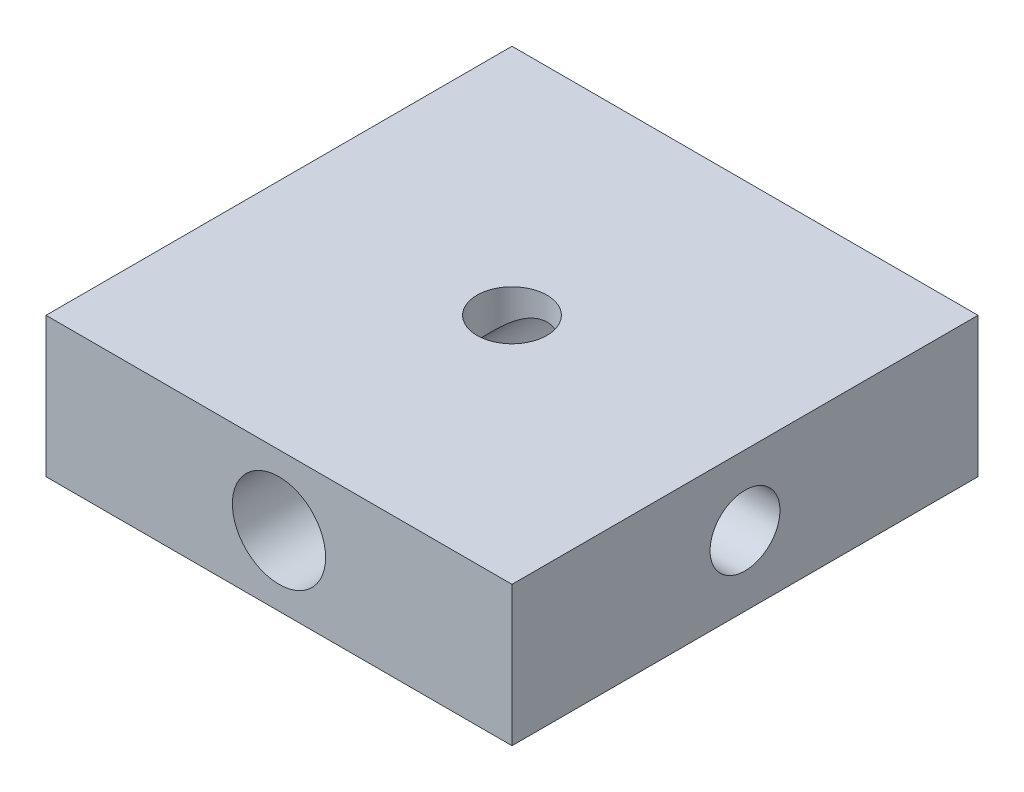
ISO-10303-21;
HEADER;
FILE_DESCRIPTION(('STEP AP214'),'2;1');
FILE_NAME('part.step','',(''),(''),'','','');
FILE_SCHEMA(('AUTOMOTIVE_DESIGN { 1 0 10303 214 1 1 1 1 }'));
ENDSEC;
DATA;
#1=APPLICATION_CONTEXT('core data for automotive mechanical design processes');
#2=APPLICATION_PROTOCOL_DEFINITION('international standard','automotive_design',2000,#1);
#3=PRODUCT_CONTEXT('',#1,'mechanical');
#4=PRODUCT('Part','Part','',(#3));
#5=PRODUCT_RELATED_PRODUCT_CATEGORY('part','',(#4));
#6=PRODUCT_DEFINITION_FORMATION('','',#4);
#7=PRODUCT_DEFINITION_CONTEXT('part definition',#1,'design');
#8=PRODUCT_DEFINITION('design','',#6,#7);
#9=PRODUCT_DEFINITION_SHAPE('','',#8);
#10=(LENGTH_UNIT() NAMED_UNIT(*) SI_UNIT(.MILLI.,.METRE.));
#11=(NAMED_UNIT(*) PLANE_ANGLE_UNIT() SI_UNIT($,.RADIAN.));
#12=(NAMED_UNIT(*) SI_UNIT($,.STERADIAN.) SOLID_ANGLE_UNIT());
#13=UNCERTAINTY_MEASURE_WITH_UNIT(LENGTH_MEASURE(1.E-05),#10,'distance_accuracy_value','');
#14=(GEOMETRIC_REPRESENTATION_CONTEXT(3) GLOBAL_UNCERTAINTY_ASSIGNED_CONTEXT((#13)) GLOBAL_UNIT_ASSIGNED_CONTEXT((#10,
#11,#12)) REPRESENTATION_CONTEXT('',''));
#15=CARTESIAN_POINT('',(0.,0.,0.));
#16=DIRECTION('',(0.,0.,1.));
#17=DIRECTION('',(1.,0.,0.));
#18=AXIS2_PLACEMENT_3D('',#15,#16,#17);
#19=CARTESIAN_POINT('',(10.,6.,10.));
#20=DIRECTION('',(-1.,0.,0.));
#21=DIRECTION('',(0.,0.,1.));
#22=AXIS2_PLACEMENT_3D('',#19,#20,#21);
#23=PLANE('',#22);
#24=CARTESIAN_POINT('',(10.,3.,0.));
#25=DIRECTION('',(1.,0.,0.));
#26=DIRECTION('',(0.,0.,-1.));
#27=AXIS2_PLACEMENT_3D('',#24,#25,#26);
#28=CIRCLE('',#27,1.5);
#29=CARTESIAN_POINT('',(10.,3.,-1.5));
#30=VERTEX_POINT('',#29);
#31=EDGE_CURVE('E112',#30,#30,#28,.T.);
#32=ORIENTED_EDGE('',*,*,#31,.F.);
#33=EDGE_LOOP('',(#32));
#34=FACE_BOUND('',#33,.T.);
#35=DIRECTION('',(0.,0.,-1.));
#36=VECTOR('',#35,1.);
#37=CARTESIAN_POINT('',(10.,0.,10.));
#38=LINE('',#37,#36);
#39=CARTESIAN_POINT('',(10.,0.,10.));
#40=VERTEX_POINT('',#39);
#41=CARTESIAN_POINT('',(10.,0.,-10.));
#42=VERTEX_POINT('',#41);
#43=EDGE_CURVE('E150',#40,#42,#38,.T.);
#44=ORIENTED_EDGE('',*,*,#43,.T.);
#45=DIRECTION('',(0.,-1.,0.));
#46=VECTOR('',#45,1.);
#47=CARTESIAN_POINT('',(10.,6.,-10.));
#48=LINE('',#47,#46);
#49=CARTESIAN_POINT('',(10.,6.,-10.));
#50=VERTEX_POINT('',#49);
#51=EDGE_CURVE('E57',#50,#42,#48,.T.);
#52=ORIENTED_EDGE('',*,*,#51,.F.);
#53=DIRECTION('',(0.,0.,-1.));
#54=VECTOR('',#53,1.);
#55=CARTESIAN_POINT('',(10.,6.,10.));
#56=LINE('',#55,#54);
#57=CARTESIAN_POINT('',(10.,6.,10.));
#58=VERTEX_POINT('',#57);
#59=EDGE_CURVE('E152',#58,#50,#56,.T.);
#60=ORIENTED_EDGE('',*,*,#59,.F.);
#61=DIRECTION('',(0.,-1.,0.));
#62=VECTOR('',#61,1.);
#63=CARTESIAN_POINT('',(10.,6.,10.));
#64=LINE('',#63,#62);
#65=EDGE_CURVE('E162',#58,#40,#64,.T.);
#66=ORIENTED_EDGE('',*,*,#65,.T.);
#67=EDGE_LOOP('',(#44,#52,#60,#66));
#68=FACE_BOUND('',#67,.T.);
#69=ADVANCED_FACE('F43',(#34,#68),#23,.F.);
#70=CARTESIAN_POINT('',(-10.,6.,-10.));
#71=DIRECTION('',(0.,0.,1.));
#72=DIRECTION('',(1.,0.,0.));
#73=AXIS2_PLACEMENT_3D('',#70,#71,#72);
#74=PLANE('',#73);
#75=CARTESIAN_POINT('',(0.,3.,-10.));
#76=DIRECTION('',(0.,0.,1.));
#77=DIRECTION('',(1.,0.,0.));
#78=AXIS2_PLACEMENT_3D('',#75,#76,#77);
#79=CIRCLE('',#78,2.);
#80=CARTESIAN_POINT('',(2.,3.,-10.));
#81=VERTEX_POINT('',#80);
#82=EDGE_CURVE('E121',#81,#81,#79,.T.);
#83=ORIENTED_EDGE('',*,*,#82,.T.);
#84=EDGE_LOOP('',(#83));
#85=FACE_BOUND('',#84,.T.);
#86=DIRECTION('',(-1.,0.,0.));
#87=VECTOR('',#86,1.);
#88=CARTESIAN_POINT('',(-10.,0.,-10.));
#89=LINE('',#88,#87);
#90=CARTESIAN_POINT('',(-10.,0.,-10.));
#91=VERTEX_POINT('',#90);
#92=EDGE_CURVE('E166',#42,#91,#89,.T.);
#93=ORIENTED_EDGE('',*,*,#92,.T.);
#94=DIRECTION('',(0.,-1.,0.));
#95=VECTOR('',#94,1.);
#96=CARTESIAN_POINT('',(-10.,6.,-10.));
#97=LINE('',#96,#95);
#98=CARTESIAN_POINT('',(-10.,6.,-10.));
#99=VERTEX_POINT('',#98);
#100=EDGE_CURVE('E178',#99,#91,#97,.T.);
#101=ORIENTED_EDGE('',*,*,#100,.F.);
#102=DIRECTION('',(-1.,0.,0.));
#103=VECTOR('',#102,1.);
#104=CARTESIAN_POINT('',(-10.,6.,-10.));
#105=LINE('',#104,#103);
#106=EDGE_CURVE('E100',#50,#99,#105,.T.);
#107=ORIENTED_EDGE('',*,*,#106,.F.);
#108=ORIENTED_EDGE('',*,*,#51,.T.);
#109=EDGE_LOOP('',(#93,#101,#107,#108));
#110=FACE_BOUND('',#109,.T.);
#111=ADVANCED_FACE('F186',(#85,#110),#74,.F.);
#112=CARTESIAN_POINT('',(-10.,6.,10.));
#113=DIRECTION('',(1.,0.,0.));
#114=DIRECTION('',(0.,0.,-1.));
#115=AXIS2_PLACEMENT_3D('',#112,#113,#114);
#116=PLANE('',#115);
#117=CARTESIAN_POINT('',(-10.,3.,0.));
#118=DIRECTION('',(-1.,0.,0.));
#119=DIRECTION('',(0.,0.,1.));
#120=AXIS2_PLACEMENT_3D('',#117,#118,#119);
#121=CIRCLE('',#120,1.);
#122=CARTESIAN_POINT('',(-10.,3.,1.));
#123=VERTEX_POINT('',#122);
#124=EDGE_CURVE('E217',#123,#123,#121,.T.);
#125=ORIENTED_EDGE('',*,*,#124,.F.);
#126=EDGE_LOOP('',(#125));
#127=FACE_BOUND('',#126,.T.);
#128=DIRECTION('',(0.,0.,1.));
#129=VECTOR('',#128,1.);
#130=CARTESIAN_POINT('',(-10.,0.,10.));
#131=LINE('',#130,#129);
#132=CARTESIAN_POINT('',(-10.,0.,10.));
#133=VERTEX_POINT('',#132);
#134=EDGE_CURVE('E169',#91,#133,#131,.T.);
#135=ORIENTED_EDGE('',*,*,#134,.T.);
#136=DIRECTION('',(0.,-1.,0.));
#137=VECTOR('',#136,1.);
#138=CARTESIAN_POINT('',(-10.,6.,10.));
#139=LINE('',#138,#137);
#140=CARTESIAN_POINT('',(-10.,6.,10.));
#141=VERTEX_POINT('',#140);
#142=EDGE_CURVE('E176',#141,#133,#139,.T.);
#143=ORIENTED_EDGE('',*,*,#142,.F.);
#144=DIRECTION('',(0.,0.,1.));
#145=VECTOR('',#144,1.);
#146=CARTESIAN_POINT('',(-10.,6.,10.));
#147=LINE('',#146,#145);
#148=EDGE_CURVE('E157',#99,#141,#147,.T.);
#149=ORIENTED_EDGE('',*,*,#148,.F.);
#150=ORIENTED_EDGE('',*,*,#100,.T.);
#151=EDGE_LOOP('',(#135,#143,#149,#150));
#152=FACE_BOUND('',#151,.T.);
#153=ADVANCED_FACE('F193',(#127,#152),#116,.F.);
#154=CARTESIAN_POINT('',(-10.,6.,10.));
#155=DIRECTION('',(0.,0.,-1.));
#156=DIRECTION('',(-1.,0.,0.));
#157=AXIS2_PLACEMENT_3D('',#154,#155,#156);
#158=PLANE('',#157);
#159=CARTESIAN_POINT('',(0.,3.,10.));
#160=DIRECTION('',(0.,0.,1.));
#161=DIRECTION('',(1.,0.,0.));
#162=AXIS2_PLACEMENT_3D('',#159,#160,#161);
#163=CIRCLE('',#162,2.);
#164=CARTESIAN_POINT('',(2.,3.,10.));
#165=VERTEX_POINT('',#164);
#166=EDGE_CURVE('E116',#165,#165,#163,.T.);
#167=ORIENTED_EDGE('',*,*,#166,.F.);
#168=EDGE_LOOP('',(#167));
#169=FACE_BOUND('',#168,.T.);
#170=DIRECTION('',(1.,0.,0.));
#171=VECTOR('',#170,1.);
#172=CARTESIAN_POINT('',(-10.,0.,10.));
#173=LINE('',#172,#171);
#174=EDGE_CURVE('E92',#133,#40,#173,.T.);
#175=ORIENTED_EDGE('',*,*,#174,.T.);
#176=ORIENTED_EDGE('',*,*,#65,.F.);
#177=DIRECTION('',(1.,0.,0.));
#178=VECTOR('',#177,1.);
#179=CARTESIAN_POINT('',(-10.,6.,10.));
#180=LINE('',#179,#178);
#181=EDGE_CURVE('E71',#141,#58,#180,.T.);
#182=ORIENTED_EDGE('',*,*,#181,.F.);
#183=ORIENTED_EDGE('',*,*,#142,.T.);
#184=EDGE_LOOP('',(#175,#176,#182,#183));
#185=FACE_BOUND('',#184,.T.);
#186=ADVANCED_FACE('F194',(#169,#185),#158,.F.);
#187=CARTESIAN_POINT('',(0.,6.,0.));
#188=DIRECTION('',(0.,-1.,0.));
#189=DIRECTION('',(0.,0.,-1.));
#190=AXIS2_PLACEMENT_3D('',#187,#188,#189);
#191=PLANE('',#190);
#192=CARTESIAN_POINT('',(0.,6.,0.));
#193=DIRECTION('',(0.,1.,0.));
#194=DIRECTION('',(0.,0.,1.));
#195=AXIS2_PLACEMENT_3D('',#192,#193,#194);
#196=CIRCLE('',#195,1.5);
#197=CARTESIAN_POINT('',(0.,6.,1.5));
#198=VERTEX_POINT('',#197);
#199=EDGE_CURVE('E111',#198,#198,#196,.T.);
#200=ORIENTED_EDGE('',*,*,#199,.F.);
#201=EDGE_LOOP('',(#200));
#202=FACE_BOUND('',#201,.T.);
#203=ORIENTED_EDGE('',*,*,#59,.T.);
#204=ORIENTED_EDGE('',*,*,#106,.T.);
#205=ORIENTED_EDGE('',*,*,#148,.T.);
#206=ORIENTED_EDGE('',*,*,#181,.T.);
#207=EDGE_LOOP('',(#203,#204,#205,#206));
#208=FACE_BOUND('',#207,.T.);
#209=ADVANCED_FACE('F195',(#202,#208),#191,.F.);
#210=CARTESIAN_POINT('',(0.,0.,0.));
#211=DIRECTION('',(0.,-1.,0.));
#212=DIRECTION('',(0.,0.,-1.));
#213=AXIS2_PLACEMENT_3D('',#210,#211,#212);
#214=PLANE('',#213);
#215=ORIENTED_EDGE('',*,*,#43,.F.);
#216=ORIENTED_EDGE('',*,*,#174,.F.);
#217=ORIENTED_EDGE('',*,*,#134,.F.);
#218=ORIENTED_EDGE('',*,*,#92,.F.);
#219=EDGE_LOOP('',(#215,#216,#217,#218));
#220=FACE_BOUND('',#219,.T.);
#221=ADVANCED_FACE('F191',(#220),#214,.T.);
#222=CARTESIAN_POINT('',(0.,3.,-10.));
#223=DIRECTION('',(0.,0.,1.));
#224=DIRECTION('',(1.,0.,0.));
#225=AXIS2_PLACEMENT_3D('',#222,#223,#224);
#226=CYLINDRICAL_SURFACE('',#225,2.);
#227=CARTESIAN_POINT('',(-2.,3.,1.));
#228=CARTESIAN_POINT('',(-1.99999713404151,3.05257196295299,0.999996697680499));
#229=CARTESIAN_POINT('',(-1.99790491019518,3.10520659969803,0.995829926878325));
#230=CARTESIAN_POINT('',(-1.98974156037396,3.20892023526843,0.979347119659082));
#231=CARTESIAN_POINT('',(-1.98366287828984,3.2599960867135,0.96701560700235));
#232=CARTESIAN_POINT('',(-1.96816279403312,3.35893354488057,0.934806191383206));
#233=CARTESIAN_POINT('',(-1.9587543917752,3.40680680293918,0.914957615751988));
#234=CARTESIAN_POINT('',(-1.93745776515779,3.49847261680656,0.868429378635059));
#235=CARTESIAN_POINT('',(-1.9255697363353,3.54226549399005,0.841750255751148));
#236=CARTESIAN_POINT('',(-1.89956258258057,3.62750781776192,0.780482750514702));
#237=CARTESIAN_POINT('',(-1.88535199127536,3.66865521112211,0.745513520760358));
#238=CARTESIAN_POINT('',(-1.85659970246744,3.74477944486698,0.669478520752967));
#239=CARTESIAN_POINT('',(-1.84205776209035,3.77975158310677,0.62840814822756));
#240=CARTESIAN_POINT('',(-1.81298951197347,3.84525200045028,0.537516650476618));
#241=CARTESIAN_POINT('',(-1.79855186970132,3.87522533555164,0.487263901654088));
#242=CARTESIAN_POINT('',(-1.77285978772321,3.9261682268907,0.381632664013786));
#243=CARTESIAN_POINT('',(-1.7616030760699,3.94714421496633,0.326257871277251));
#244=CARTESIAN_POINT('',(-1.74457867037808,3.97813244218859,0.215334894578078));
#245=CARTESIAN_POINT('',(-1.73852271583714,3.98872585708044,0.159995547932606));
#246=CARTESIAN_POINT('',(-1.73181889948528,4.00042699330885,0.0480211622205235));
#247=CARTESIAN_POINT('',(-1.73116569343288,4.00154408837307,-0.00861254087115446));
#248=CARTESIAN_POINT('',(-1.73510930257248,3.99468728717229,-0.114286024315368));
#249=CARTESIAN_POINT('',(-1.73908763662014,3.98778455953682,-0.16342403122305));
#250=CARTESIAN_POINT('',(-1.7507622873385,3.96693984905693,-0.259721909373042));
#251=CARTESIAN_POINT('',(-1.75845978831776,3.95299562389765,-0.306881145305316));
#252=CARTESIAN_POINT('',(-1.77687476412741,3.918209780386,-0.399229132565659));
#253=CARTESIAN_POINT('',(-1.78765840663999,3.897215067116,-0.444346398785789));
#254=CARTESIAN_POINT('',(-1.81103404281404,3.849041687668,-0.530634292590008));
#255=CARTESIAN_POINT('',(-1.82362684780191,3.82186024381247,-0.571803135600089));
#256=CARTESIAN_POINT('',(-1.85113157903286,3.75806605491279,-0.654521252743226));
#257=CARTESIAN_POINT('',(-1.86613510236746,3.72069445836928,-0.695456873576157));
#258=CARTESIAN_POINT('',(-1.89547623300407,3.63955557874137,-0.770735418590901));
#259=CARTESIAN_POINT('',(-1.90981351958801,3.59578525657429,-0.805075192033883));
#260=CARTESIAN_POINT('',(-1.93701987282964,3.50051650583185,-0.867685661029727));
#261=CARTESIAN_POINT('',(-1.94978984162007,3.44875359159941,-0.89560047244574));
#262=CARTESIAN_POINT('',(-1.97157881121242,3.3404662154888,-0.942097029043009));
#263=CARTESIAN_POINT('',(-1.98060078943553,3.28394557626528,-0.960686185015167));
#264=CARTESIAN_POINT('',(-1.99324333741436,3.1727664916607,-0.986475403716676));
#265=CARTESIAN_POINT('',(-1.99724938301312,3.11834153054832,-0.994491235746778));
#266=CARTESIAN_POINT('',(-2.00073013459102,3.00877959994935,-1.00146473113449));
#267=CARTESIAN_POINT('',(-2.00020698721312,2.9536429801301,-1.00042668563948));
#268=CARTESIAN_POINT('',(-1.99491192253441,2.84876702801401,-0.989793311581246));
#269=CARTESIAN_POINT('',(-1.9904724568819,2.79894059195005,-0.98086746726997));
#270=CARTESIAN_POINT('',(-1.97822171314819,2.70159310769808,-0.955761928104915));
#271=CARTESIAN_POINT('',(-1.97041006334332,2.654072314309,-0.939581433546641));
#272=CARTESIAN_POINT('',(-1.95184251413669,2.56111139155033,-0.900001533566828));
#273=CARTESIAN_POINT('',(-1.94100881769939,2.51576960299385,-0.876408949883188));
#274=CARTESIAN_POINT('',(-1.91743974317109,2.42953863830108,-0.822892464353958));
#275=CARTESIAN_POINT('',(-1.90470355565785,2.38865137022472,-0.792965865406568));
#276=CARTESIAN_POINT('',(-1.87708221337464,2.30823231070935,-0.724239574667126));
#277=CARTESIAN_POINT('',(-1.86210884848441,2.26922792217536,-0.684857131546435));
#278=CARTESIAN_POINT('',(-1.83262391603874,2.19814367888676,-0.600074848730696));
#279=CARTESIAN_POINT('',(-1.81811267381526,2.16606861430916,-0.554670881183626));
#280=CARTESIAN_POINT('',(-1.79051192226068,2.1082920855023,-0.456356345799688));
#281=CARTESIAN_POINT('',(-1.77752529663472,2.08297450412136,-0.403188733791405));
#282=CARTESIAN_POINT('',(-1.75574072368126,2.0419171739862,-0.292489932307478));
#283=CARTESIAN_POINT('',(-1.74693738240618,2.02616508411243,-0.234964473498813));
#284=CARTESIAN_POINT('',(-1.73561501008667,2.00613831255032,-0.123089777138552));
#285=CARTESIAN_POINT('',(-1.73257383460491,2.00090700359914,-0.0689657465709642));
#286=CARTESIAN_POINT('',(-1.73165354646175,1.99931084561921,0.0394470671707284));
#287=CARTESIAN_POINT('',(-1.73377219627553,2.0029421533756,0.0937357687394335));
#288=CARTESIAN_POINT('',(-1.74237862050025,2.01807387440774,0.195483501532015));
#289=CARTESIAN_POINT('',(-1.74843094482394,2.0287916856572,0.2431004701444));
#290=CARTESIAN_POINT('',(-1.76371016187918,2.05682464177536,0.335808119424706));
#291=CARTESIAN_POINT('',(-1.77293807569676,2.07414190884019,0.380897982091967));
#292=CARTESIAN_POINT('',(-1.79428530364528,2.11618425469932,0.470624850986606));
#293=CARTESIAN_POINT('',(-1.80655722396191,2.14132886218354,0.515027901829701));
#294=CARTESIAN_POINT('',(-1.8323533163459,2.19784902836337,0.599274536180586));
#295=CARTESIAN_POINT('',(-1.84587813794522,2.22922782876135,0.63911573051849));
#296=CARTESIAN_POINT('',(-1.87462323159313,2.30179667333536,0.718141982357616));
#297=CARTESIAN_POINT('',(-1.88984983311469,2.34371557698983,0.756659102361922));
#298=CARTESIAN_POINT('',(-1.91877752255088,2.43384519377972,0.826262983423633));
#299=CARTESIAN_POINT('',(-1.9324777860804,2.48205927674322,0.857345739426289));
#300=CARTESIAN_POINT('',(-1.95698009585103,2.58406840318005,0.911236362762204));
#301=CARTESIAN_POINT('',(-1.96776096562909,2.63790049606539,0.933984169411435));
#302=CARTESIAN_POINT('',(-1.98501341363465,2.74925789870581,0.969808167918952));
#303=CARTESIAN_POINT('',(-1.99149723372932,2.80677220037683,0.982911846829578));
#304=CARTESIAN_POINT('',(-1.99695461909663,2.88739805351662,0.99389741107585));
#305=CARTESIAN_POINT('',(-1.99809365339202,2.9098381205605,0.99618264086362));
#306=CARTESIAN_POINT('',(-1.99961696977865,2.95484826819284,0.999234665516806));
#307=CARTESIAN_POINT('',(-2.00000123103763,2.97741835235262,1.0000014184712));
#308=CARTESIAN_POINT('',(-2.,3.,1.));
#309=B_SPLINE_CURVE_WITH_KNOTS('',3,(#227,#228,#229,#230,#231,#232,#233,#234,#235,#236,#237,
#238,#239,#240,#241,#242,#243,#244,#245,#246,#247,#248,#249,#250,#251,#252,#253,#254,#255,#256,
#257,#258,#259,#260,#261,#262,#263,#264,#265,#266,#267,#268,#269,#270,#271,#272,#273,#274,#275,
#276,#277,#278,#279,#280,#281,#282,#283,#284,#285,#286,#287,#288,#289,#290,#291,#292,#293,#294,
#295,#296,#297,#298,#299,#300,#301,#302,#303,#304,#305,#306,#307,#308),.UNSPECIFIED.,.T.,.F.,(4,
2,2,2,2,2,2,2,2,2,2,2,2,2,2,2,2,2,2,2,2,2,2,2,2,2,2,2,2,2,2,2,2,2,2,2,2,2,2,2,4),(0.,
0.157624257420292,0.315548149709198,0.472862155492298,0.630163760581567,0.796981758718089,
0.963926237654035,1.14381726430753,1.32357947898281,1.49258012140229,1.6614135732902,
1.81005712409321,1.95874803925678,2.11090240168487,2.26312521260222,2.43464941333878,
2.60625534598686,2.78583022214441,2.9652621691228,3.12983290471346,3.29432564511476,
3.44606906506122,3.59782921630931,3.75392856027899,3.91009450748339,4.08159610644419,
4.25321588615432,4.43314682159674,4.61284511940778,4.77529307498374,4.93767059860005,
5.08457930244183,5.23153528783678,5.38836456775614,5.54527561138958,5.72125242752499,
5.89732383376573,6.07464013662925,6.2514490862493,6.31915280137698,6.38685838514847),.UNSPECIFIED.);
#310=CARTESIAN_POINT('',(-2.,3.,1.));
#311=VERTEX_POINT('',#310);
#312=EDGE_CURVE('E46',#311,#311,#309,.T.);
#313=ORIENTED_EDGE('',*,*,#312,.T.);
#314=EDGE_LOOP('',(#313));
#315=FACE_BOUND('',#314,.T.);
#316=CARTESIAN_POINT('',(0.,5.,1.5));
#317=CARTESIAN_POINT('',(0.0732207358411543,4.99999540196395,1.49999520798798));
#318=CARTESIAN_POINT('',(0.146561062021485,4.99593645526274,1.4945949756255));
#319=CARTESIAN_POINT('',(0.290936396286467,4.98006607281083,1.47333293658984));
#320=CARTESIAN_POINT('',(0.361965136229004,4.96823514679854,1.45744482834995));
#321=CARTESIAN_POINT('',(0.499234626631249,4.9379567495606,1.41628709071623));
#322=CARTESIAN_POINT('',(0.565501615403737,4.91954951932009,1.39107448643083));
#323=CARTESIAN_POINT('',(0.692422335520753,4.87750556721694,1.33245765581277));
#324=CARTESIAN_POINT('',(0.753077701796332,4.85387037535483,1.29905582580648));
#325=CARTESIAN_POINT('',(0.873465937590145,4.80049544543983,1.22173698840918));
#326=CARTESIAN_POINT('',(0.932593229272032,4.7703930854844,1.17713267066593));
#327=CARTESIAN_POINT('',(1.04302716767671,4.70767017883378,1.08050416263883));
#328=CARTESIAN_POINT('',(1.09432148272226,4.67504578078609,1.02846851720017));
#329=CARTESIAN_POINT('',(1.19837161436623,4.6027112365199,0.906417046721634));
#330=CARTESIAN_POINT('',(1.24930578421204,4.56290854864639,0.834896322878296));
#331=CARTESIAN_POINT('',(1.33861998176348,4.48711444664135,0.682548987633455));
#332=CARTESIAN_POINT('',(1.37701716983077,4.45111786883675,0.601735302999691));
#333=CARTESIAN_POINT('',(1.42880627811788,4.39977155180179,0.460497161323767));
#334=CARTESIAN_POINT('',(1.44625674456539,4.38157751186733,0.402609302871619));
#335=CARTESIAN_POINT('',(1.47420672564844,4.35171594150685,0.28360726521508));
#336=CARTESIAN_POINT('',(1.48472215355267,4.34003347910832,0.22250082212521));
#337=CARTESIAN_POINT('',(1.49812822141445,4.32503759684553,0.0978174144692322));
#338=CARTESIAN_POINT('',(1.50094954854207,4.32180026676597,0.034223193275945));
#339=CARTESIAN_POINT('',(1.49848213241869,4.32459531776068,-0.0926149108815744));
#340=CARTESIAN_POINT('',(1.49319048157349,4.33063102218113,-0.155858660087438));
#341=CARTESIAN_POINT('',(1.47597739291882,4.34967623262519,-0.273191347425791));
#342=CARTESIAN_POINT('',(1.46482486380817,4.36187157059871,-0.327536371046184));
#343=CARTESIAN_POINT('',(1.43705671120732,4.39114192844939,-0.433438878720877));
#344=CARTESIAN_POINT('',(1.42043583681172,4.40822163640769,-0.484993627823595));
#345=CARTESIAN_POINT('',(1.37033064172535,4.45741769294306,-0.616256386634149));
#346=CARTESIAN_POINT('',(1.3328014849398,4.49225649139233,-0.693400416643509));
#347=CARTESIAN_POINT('',(1.24618023314519,4.56533298145196,-0.839196523869085));
#348=CARTESIAN_POINT('',(1.19706004255878,4.60357878886109,-0.90782733925466));
#349=CARTESIAN_POINT('',(1.08651604102135,4.68051672313145,-1.03775339040365));
#350=CARTESIAN_POINT('',(1.02481375526036,4.71919586730239,-1.09882060688148));
#351=CARTESIAN_POINT('',(0.890422521709589,4.79248037980972,-1.21026364678116));
#352=CARTESIAN_POINT('',(0.817755054293756,4.8270934826376,-1.26065992023038));
#353=CARTESIAN_POINT('',(0.677902080454142,4.88279726073643,-1.33998079924033));
#354=CARTESIAN_POINT('',(0.61253987018562,4.90520770945008,-1.37118459421578));
#355=CARTESIAN_POINT('',(0.476352173202087,4.94372904416948,-1.42422488046386));
#356=CARTESIAN_POINT('',(0.405530141063766,4.95984387504352,-1.44606723849928));
#357=CARTESIAN_POINT('',(0.259676232483518,4.98445588635989,-1.47925336288644));
#358=CARTESIAN_POINT('',(0.184621281405942,4.99290592971749,-1.49053217893863));
#359=CARTESIAN_POINT('',(0.0332012397969168,5.00115883659445,-1.50154959737171));
#360=CARTESIAN_POINT('',(-0.0431632843727236,5.00096534845408,-1.50129306869537));
#361=CARTESIAN_POINT('',(-0.186804217329625,4.99242547175873,-1.48988913072681));
#362=CARTESIAN_POINT('',(-0.254222327546133,4.98490086600401,-1.47983946311133));
#363=CARTESIAN_POINT('',(-0.386110670609117,4.96351320201588,-1.45102621999213));
#364=CARTESIAN_POINT('',(-0.45058027298726,4.94964879507262,-1.43226079031059));
#365=CARTESIAN_POINT('',(-0.577416779689769,4.91599830683313,-1.3861124694069));
#366=CARTESIAN_POINT('',(-0.639629172536139,4.89602050290193,-1.3584488185726));
#367=CARTESIAN_POINT('',(-0.758518527043073,4.85166985411963,-1.29582754457441));
#368=CARTESIAN_POINT('',(-0.815194721336403,4.82729640132068,-1.26086891236026));
#369=CARTESIAN_POINT('',(-0.931511626319037,4.77119146886499,-1.17821675358944));
#370=CARTESIAN_POINT('',(-0.990066762698701,4.73891095025037,-1.12937146056255));
#371=CARTESIAN_POINT('',(-1.09871974855854,4.67238952874785,-1.02399124741161));
#372=CARTESIAN_POINT('',(-1.14879830469577,4.63814438507395,-0.967439300306642));
#373=CARTESIAN_POINT('',(-1.24877541075626,4.56369128291497,-0.835850119038824));
#374=CARTESIAN_POINT('',(-1.29683043648705,4.523587185201,-0.759342438507699));
#375=CARTESIAN_POINT('',(-1.37923235998282,4.44940591348451,-0.596639922027547));
#376=CARTESIAN_POINT('',(-1.41362000515519,4.41531099570969,-0.510474878091426));
#377=CARTESIAN_POINT('',(-1.45615734256767,4.37118877808583,-0.364585551125525));
#378=CARTESIAN_POINT('',(-1.46931009512996,4.35695811824565,-0.307608873597619));
#379=CARTESIAN_POINT('',(-1.48891522181906,4.33542056103011,-0.191292953016819));
#380=CARTESIAN_POINT('',(-1.4953825519924,4.32809821220233,-0.131959293197749));
#381=CARTESIAN_POINT('',(-1.50115320209064,4.32157601792209,-0.0121709201886719));
#382=CARTESIAN_POINT('',(-1.50042015325262,4.32241740684975,0.0482879430095718));
#383=CARTESIAN_POINT('',(-1.49176883838219,4.33216448543666,0.168056838752157));
#384=CARTESIAN_POINT('',(-1.48384130024585,4.34108058157484,0.227365287897257));
#385=CARTESIAN_POINT('',(-1.45893841819723,4.36817348797773,0.3559145714108));
#386=CARTESIAN_POINT('',(-1.44036567954111,4.38794705950643,0.424497180132774));
#387=CARTESIAN_POINT('',(-1.39469627266119,4.4338296338541,0.556534848830485));
#388=CARTESIAN_POINT('',(-1.3675780729773,4.4599546014693,0.619976442038188));
#389=CARTESIAN_POINT('',(-1.29498918933643,4.52516477328824,0.762520630486333));
#390=CARTESIAN_POINT('',(-1.2464154206597,4.56560203191105,0.839421582755754));
#391=CARTESIAN_POINT('',(-1.13650718465936,4.64713510181273,0.983126044977565));
#392=CARTESIAN_POINT('',(-1.07516134758577,4.68823146954222,1.04992046594485));
#393=CARTESIAN_POINT('',(-0.939627144937892,4.76728988939793,1.17283184228333));
#394=CARTESIAN_POINT('',(-0.865337161562861,4.80522333711072,1.22885631937719));
#395=CARTESIAN_POINT('',(-0.705159098936205,4.87357289668097,1.32722305114535));
#396=CARTESIAN_POINT('',(-0.619299420401795,4.90400691592959,1.36959797457251));
#397=CARTESIAN_POINT('',(-0.464840290356455,4.94636704624048,1.42779942098571));
#398=CARTESIAN_POINT('',(-0.398553614774733,4.96110322499718,1.44776673137617));
#399=CARTESIAN_POINT('',(-0.26284161039276,4.98383739970238,1.47841790261149));
#400=CARTESIAN_POINT('',(-0.193425623834906,4.99185421210894,1.48912769024996));
#401=CARTESIAN_POINT('',(-0.102963309861889,4.99745471706309,1.49660469421435));
#402=CARTESIAN_POINT('',(-0.0824069459941235,4.9984076143208,1.49787627748942));
#403=CARTESIAN_POINT('',(-0.0412368896243779,4.99968095423138,1.49957467323097));
#404=CARTESIAN_POINT('',(-0.0206231884283879,5.00000129507253,1.50000134970737));
#405=CARTESIAN_POINT('',(0.,5.,1.5));
#406=B_SPLINE_CURVE_WITH_KNOTS('',3,(#316,#317,#318,#319,#320,#321,#322,#323,#324,#325,#326,
#327,#328,#329,#330,#331,#332,#333,#334,#335,#336,#337,#338,#339,#340,#341,#342,#343,#344,#345,
#346,#347,#348,#349,#350,#351,#352,#353,#354,#355,#356,#357,#358,#359,#360,#361,#362,#363,#364,
#365,#366,#367,#368,#369,#370,#371,#372,#373,#374,#375,#376,#377,#378,#379,#380,#381,#382,#383,
#384,#385,#386,#387,#388,#389,#390,#391,#392,#393,#394,#395,#396,#397,#398,#399,#400,#401,#402,
#403,#404,#405),.UNSPECIFIED.,.T.,.F.,(4,2,2,2,2,2,2,2,2,2,2,2,2,2,2,2,2,2,2,2,2,2,2,2,2,2,2,2,
2,2,2,2,2,2,2,2,2,2,2,2,2,2,2,2,4),(0.,0.219571786572042,0.439696319423244,0.658496333573381,
0.877232398849293,1.1162243131743,1.35558868405162,1.64360015887451,1.93121574056507,
2.11999518529902,2.3083399319529,2.49837587621257,2.6884799430021,2.85826890162709,
3.0282213760064,3.3044933180591,3.58144192357889,3.86535883938091,4.14872662493691,
4.37526505006389,4.60166129643117,4.82944058166899,5.05712372466614,5.26191187011994,
5.46674360185812,5.6788043948368,5.89089453977541,6.13840382081868,6.38646908985452,
6.68168596015947,6.97601595850113,7.15589161422933,7.33536399114208,7.51574333854741,
7.69635548563854,7.91639670960135,8.13699685139922,8.43412246655768,8.73151372390893,
9.0313544949265,9.33047220273164,9.5419569754163,9.75284752283257,9.81468166878711,
9.87652576630966),.UNSPECIFIED.);
#407=CARTESIAN_POINT('',(1.4142135623731,4.41421356237309,-0.499999999999999));
#408=VERTEX_POINT('',#407);
#409=CARTESIAN_POINT('',(1.4142135623731,4.41421356237309,0.500000000000001));
#410=VERTEX_POINT('',#409);
#411=EDGE_CURVE('E109',#408,#410,#406,.T.);
#412=ORIENTED_EDGE('',*,*,#411,.T.);
#413=CARTESIAN_POINT('',(2.,3.,-1.5));
#414=CARTESIAN_POINT('',(1.99999540196395,3.07322073584115,-1.49999520798798));
#415=CARTESIAN_POINT('',(1.99593645526274,3.14656106202149,-1.4945949756255));
#416=CARTESIAN_POINT('',(1.98006607281083,3.29093639628647,-1.47333293658984));
#417=CARTESIAN_POINT('',(1.96823514679854,3.361965136229,-1.45744482834994));
#418=CARTESIAN_POINT('',(1.9379567495606,3.49923462663125,-1.41628709071623));
#419=CARTESIAN_POINT('',(1.91954951932009,3.56550161540374,-1.39107448643082));
#420=CARTESIAN_POINT('',(1.87750556721694,3.69242233552075,-1.33245765581277));
#421=CARTESIAN_POINT('',(1.85387037535483,3.75307770179633,-1.29905582580648));
#422=CARTESIAN_POINT('',(1.80049544543983,3.87346593759014,-1.22173698840918));
#423=CARTESIAN_POINT('',(1.7703930854844,3.93259322927203,-1.17713267066593));
#424=CARTESIAN_POINT('',(1.70767017883378,4.0430271676767,-1.08050416263883));
#425=CARTESIAN_POINT('',(1.67504578078609,4.09432148272226,-1.02846851720017));
#426=CARTESIAN_POINT('',(1.6027112365199,4.19837161436623,-0.906417046721632));
#427=CARTESIAN_POINT('',(1.56290854864639,4.24930578421204,-0.834896322878295));
#428=CARTESIAN_POINT('',(1.48711444664135,4.33861998176348,-0.682548987633453));
#429=CARTESIAN_POINT('',(1.45111786883675,4.37701716983077,-0.601735302999689));
#430=CARTESIAN_POINT('',(1.39977155180179,4.42880627811788,-0.460497161323766));
#431=CARTESIAN_POINT('',(1.38157751186733,4.44625674456539,-0.402609302871618));
#432=CARTESIAN_POINT('',(1.35171594150685,4.47420672564844,-0.283607265215079));
#433=CARTESIAN_POINT('',(1.34003347910832,4.48472215355267,-0.222500822125208));
#434=CARTESIAN_POINT('',(1.32503759684553,4.49812822141445,-0.0978174144692309));
#435=CARTESIAN_POINT('',(1.32180026676597,4.50094954854207,-0.0342231932759439));
#436=CARTESIAN_POINT('',(1.32459531776068,4.49848213241869,0.0926149108815754));
#437=CARTESIAN_POINT('',(1.33063102218113,4.49319048157349,0.15585866008744));
#438=CARTESIAN_POINT('',(1.34967623262519,4.47597739291882,0.273191347425792));
#439=CARTESIAN_POINT('',(1.36187157059871,4.46482486380817,0.327536371046185));
#440=CARTESIAN_POINT('',(1.39114192844939,4.43705671120733,0.433438878720878));
#441=CARTESIAN_POINT('',(1.40822163640769,4.42043583681172,0.484993627823597));
#442=CARTESIAN_POINT('',(1.45741769294306,4.37033064172535,0.616256386634151));
#443=CARTESIAN_POINT('',(1.49225649139233,4.3328014849398,0.693400416643511));
#444=CARTESIAN_POINT('',(1.56533298145196,4.24618023314519,0.839196523869086));
#445=CARTESIAN_POINT('',(1.60357878886109,4.19706004255878,0.907827339254661));
#446=CARTESIAN_POINT('',(1.68051672313145,4.08651604102135,1.03775339040366));
#447=CARTESIAN_POINT('',(1.71919586730239,4.02481375526037,1.09882060688148));
#448=CARTESIAN_POINT('',(1.79248037980972,3.89042252170959,1.21026364678117));
#449=CARTESIAN_POINT('',(1.8270934826376,3.81775505429376,1.26065992023038));
#450=CARTESIAN_POINT('',(1.88279726073643,3.67790208045414,1.33998079924033));
#451=CARTESIAN_POINT('',(1.90520770945008,3.61253987018562,1.37118459421578));
#452=CARTESIAN_POINT('',(1.94372904416948,3.47635217320209,1.42422488046387));
#453=CARTESIAN_POINT('',(1.95984387504352,3.40553014106377,1.44606723849928));
#454=CARTESIAN_POINT('',(1.98445588635989,3.25967623248352,1.47925336288644));
#455=CARTESIAN_POINT('',(1.99290592971749,3.18462128140594,1.49053217893863));
#456=CARTESIAN_POINT('',(2.00115883659445,3.03320123979692,1.50154959737171));
#457=CARTESIAN_POINT('',(2.00096534845408,2.95683671562728,1.50129306869537));
#458=CARTESIAN_POINT('',(1.99242547175873,2.81319578267037,1.48988913072681));
#459=CARTESIAN_POINT('',(1.98490086600401,2.74577767245387,1.47983946311133));
#460=CARTESIAN_POINT('',(1.96351320201588,2.61388932939088,1.45102621999213));
#461=CARTESIAN_POINT('',(1.94964879507262,2.54941972701274,1.43226079031059));
#462=CARTESIAN_POINT('',(1.91599830683313,2.42258322031023,1.3861124694069));
#463=CARTESIAN_POINT('',(1.89602050290193,2.36037082746386,1.35844881857261));
#464=CARTESIAN_POINT('',(1.85166985411963,2.24148147295693,1.29582754457441));
#465=CARTESIAN_POINT('',(1.82729640132068,2.1848052786636,1.26086891236027));
#466=CARTESIAN_POINT('',(1.77119146886499,2.06848837368096,1.17821675358944));
#467=CARTESIAN_POINT('',(1.73891095025037,2.0099332373013,1.12937146056255));
#468=CARTESIAN_POINT('',(1.67238952874785,1.90128025144146,1.02399124741161));
#469=CARTESIAN_POINT('',(1.63814438507395,1.85120169530423,0.967439300306642));
#470=CARTESIAN_POINT('',(1.56369128291497,1.75122458924374,0.835850119038825));
#471=CARTESIAN_POINT('',(1.523587185201,1.70316956351295,0.7593424385077));
#472=CARTESIAN_POINT('',(1.4494059134845,1.62076764001717,0.596639922027548));
#473=CARTESIAN_POINT('',(1.41531099570969,1.58637999484481,0.510474878091426));
#474=CARTESIAN_POINT('',(1.37118877808583,1.54384265743233,0.364585551125525));
#475=CARTESIAN_POINT('',(1.35695811824564,1.53068990487004,0.307608873597618));
#476=CARTESIAN_POINT('',(1.33542056103011,1.51108477818094,0.191292953016819));
#477=CARTESIAN_POINT('',(1.32809821220233,1.5046174480076,0.131959293197749));
#478=CARTESIAN_POINT('',(1.32157601792209,1.49884679790936,0.0121709201886718));
#479=CARTESIAN_POINT('',(1.32241740684975,1.49957984674738,-0.0482879430095719));
#480=CARTESIAN_POINT('',(1.33216448543666,1.50823116161781,-0.168056838752157));
#481=CARTESIAN_POINT('',(1.34108058157484,1.51615869975416,-0.227365287897257));
#482=CARTESIAN_POINT('',(1.36817348797773,1.54106158180277,-0.355914571410799));
#483=CARTESIAN_POINT('',(1.38794705950643,1.55963432045889,-0.424497180132773));
#484=CARTESIAN_POINT('',(1.4338296338541,1.60530372733881,-0.556534848830484));
#485=CARTESIAN_POINT('',(1.4599546014693,1.6324219270227,-0.619976442038188));
#486=CARTESIAN_POINT('',(1.52516477328824,1.70501081066358,-0.762520630486333));
#487=CARTESIAN_POINT('',(1.56560203191105,1.7535845793403,-0.839421582755753));
#488=CARTESIAN_POINT('',(1.64713510181273,1.86349281534064,-0.983126044977563));
#489=CARTESIAN_POINT('',(1.68823146954223,1.92483865241423,-1.04992046594485));
#490=CARTESIAN_POINT('',(1.76728988939793,2.06037285506211,-1.17283184228333));
#491=CARTESIAN_POINT('',(1.80522333711072,2.13466283843714,-1.22885631937719));
#492=CARTESIAN_POINT('',(1.87357289668097,2.2948409010638,-1.32722305114535));
#493=CARTESIAN_POINT('',(1.90400691592959,2.38070057959821,-1.3695979745725));
#494=CARTESIAN_POINT('',(1.94636704624048,2.53515970964355,-1.42779942098571));
#495=CARTESIAN_POINT('',(1.96110322499718,2.60144638522527,-1.44776673137617));
#496=CARTESIAN_POINT('',(1.98383739970238,2.73715838960724,-1.47841790261149));
#497=CARTESIAN_POINT('',(1.99185421210894,2.8065743761651,-1.48912769024996));
#498=CARTESIAN_POINT('',(1.99745471706309,2.89703669013811,-1.49660469421435));
#499=CARTESIAN_POINT('',(1.9984076143208,2.91759305400588,-1.49787627748941));
#500=CARTESIAN_POINT('',(1.99968095423138,2.95876311037562,-1.49957467323097));
#501=CARTESIAN_POINT('',(2.00000129507253,2.97937681157161,-1.50000134970737));
#502=CARTESIAN_POINT('',(2.,3.,-1.5));
#503=B_SPLINE_CURVE_WITH_KNOTS('',3,(#413,#414,#415,#416,#417,#418,#419,#420,#421,#422,#423,
#424,#425,#426,#427,#428,#429,#430,#431,#432,#433,#434,#435,#436,#437,#438,#439,#440,#441,#442,
#443,#444,#445,#446,#447,#448,#449,#450,#451,#452,#453,#454,#455,#456,#457,#458,#459,#460,#461,
#462,#463,#464,#465,#466,#467,#468,#469,#470,#471,#472,#473,#474,#475,#476,#477,#478,#479,#480,
#481,#482,#483,#484,#485,#486,#487,#488,#489,#490,#491,#492,#493,#494,#495,#496,#497,#498,#499,
#500,#501,#502),.UNSPECIFIED.,.T.,.F.,(4,2,2,2,2,2,2,2,2,2,2,2,2,2,2,2,2,2,2,2,2,2,2,2,2,2,2,2,
2,2,2,2,2,2,2,2,2,2,2,2,2,2,2,2,4),(0.,0.219571786572042,0.439696319423243,0.658496333573381,
0.877232398849292,1.1162243131743,1.35558868405162,1.64360015887451,1.93121574056507,
2.11999518529901,2.3083399319529,2.49837587621257,2.6884799430021,2.85826890162709,
3.0282213760064,3.3044933180591,3.58144192357889,3.86535883938091,4.14872662493691,
4.37526505006389,4.60166129643117,4.82944058166899,5.05712372466613,5.26191187011994,
5.46674360185812,5.6788043948368,5.89089453977541,6.13840382081868,6.38646908985452,
6.68168596015947,6.97601595850113,7.15589161422933,7.33536399114208,7.51574333854741,
7.69635548563854,7.91639670960135,8.13699685139922,8.43412246655768,8.73151372390893,
9.0313544949265,9.33047220273164,9.5419569754163,9.75284752283257,9.81468166878711,
9.87652576630966),.UNSPECIFIED.);
#504=EDGE_CURVE('E63',#410,#408,#503,.T.);
#505=ORIENTED_EDGE('',*,*,#504,.T.);
#506=EDGE_LOOP('',(#412,#505));
#507=FACE_BOUND('',#506,.T.);
#508=ORIENTED_EDGE('',*,*,#82,.F.);
#509=EDGE_LOOP('',(#508));
#510=FACE_BOUND('',#509,.T.);
#511=ORIENTED_EDGE('',*,*,#166,.T.);
#512=EDGE_LOOP('',(#511));
#513=FACE_BOUND('',#512,.T.);
#514=ADVANCED_FACE('F107',(#315,#507,#510,#513),#226,.F.);
#515=CARTESIAN_POINT('',(0.,3.,0.));
#516=DIRECTION('',(0.,1.,0.));
#517=DIRECTION('',(0.,0.,1.));
#518=AXIS2_PLACEMENT_3D('',#515,#516,#517);
#519=CYLINDRICAL_SURFACE('',#518,1.5);
#520=ORIENTED_EDGE('',*,*,#199,.T.);
#521=EDGE_LOOP('',(#520));
#522=FACE_BOUND('',#521,.T.);
#523=ORIENTED_EDGE('',*,*,#411,.F.);
#524=CARTESIAN_POINT('',(0.,3.,0.));
#525=DIRECTION('',(-0.707106781186547,0.707106781186547,0.));
#526=DIRECTION('',(0.707106781186547,0.707106781186547,0.));
#527=AXIS2_PLACEMENT_3D('',#524,#525,#526);
#528=ELLIPSE('',#527,2.12132034355964,1.5);
#529=EDGE_CURVE('E11',#408,#410,#528,.F.);
#530=ORIENTED_EDGE('',*,*,#529,.T.);
#531=EDGE_LOOP('',(#523,#530));
#532=FACE_BOUND('',#531,.T.);
#533=ADVANCED_FACE('F114',(#522,#532),#519,.F.);
#534=CARTESIAN_POINT('',(1.,3.,0.));
#535=DIRECTION('',(1.,0.,0.));
#536=DIRECTION('',(0.,0.,-1.));
#537=AXIS2_PLACEMENT_3D('',#534,#535,#536);
#538=CYLINDRICAL_SURFACE('',#537,1.5);
#539=ORIENTED_EDGE('',*,*,#31,.T.);
#540=EDGE_LOOP('',(#539));
#541=FACE_BOUND('',#540,.T.);
#542=ORIENTED_EDGE('',*,*,#529,.F.);
#543=ORIENTED_EDGE('',*,*,#504,.F.);
#544=EDGE_LOOP('',(#542,#543));
#545=FACE_BOUND('',#544,.T.);
#546=ADVANCED_FACE('F102',(#541,#545),#538,.F.);
#547=CARTESIAN_POINT('',(-1.,3.,0.));
#548=DIRECTION('',(-1.,0.,0.));
#549=DIRECTION('',(0.,0.,1.));
#550=AXIS2_PLACEMENT_3D('',#547,#548,#549);
#551=CYLINDRICAL_SURFACE('',#550,1.);
#552=ORIENTED_EDGE('',*,*,#124,.T.);
#553=EDGE_LOOP('',(#552));
#554=FACE_BOUND('',#553,.T.);
#555=ORIENTED_EDGE('',*,*,#312,.F.);
#556=EDGE_LOOP('',(#555));
#557=FACE_BOUND('',#556,.T.);
#558=ADVANCED_FACE('F139',(#554,#557),#551,.F.);
#559=CLOSED_SHELL('',(#69,#111,#153,#186,#209,#221,#514,#533,#546,#558));
#560=MANIFOLD_SOLID_BREP('B2',#559);
#561=ADVANCED_BREP_SHAPE_REPRESENTATION('',(#18,#560),#14);
#562=SHAPE_DEFINITION_REPRESENTATION(#9,#561);
ENDSEC;
END-ISO-10303-21;
